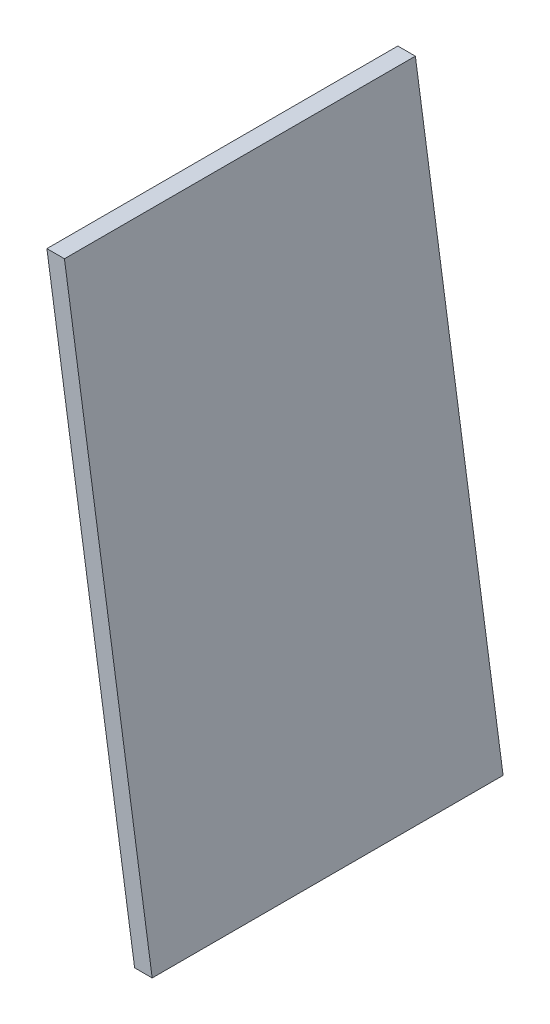
ISO-10303-21;
HEADER;
FILE_DESCRIPTION(('STEP AP214'),'2;1');
FILE_NAME('part.step','',(''),(''),'','','');
FILE_SCHEMA(('AUTOMOTIVE_DESIGN { 1 0 10303 214 1 1 1 1 }'));
ENDSEC;
DATA;
#1=APPLICATION_CONTEXT('core data for automotive mechanical design processes');
#2=APPLICATION_PROTOCOL_DEFINITION('international standard','automotive_design',2000,#1);
#3=PRODUCT_CONTEXT('',#1,'mechanical');
#4=PRODUCT('Part','Part','',(#3));
#5=PRODUCT_RELATED_PRODUCT_CATEGORY('part','',(#4));
#6=PRODUCT_DEFINITION_FORMATION('','',#4);
#7=PRODUCT_DEFINITION_CONTEXT('part definition',#1,'design');
#8=PRODUCT_DEFINITION('design','',#6,#7);
#9=PRODUCT_DEFINITION_SHAPE('','',#8);
#10=(LENGTH_UNIT() NAMED_UNIT(*) SI_UNIT(.MILLI.,.METRE.));
#11=(NAMED_UNIT(*) PLANE_ANGLE_UNIT() SI_UNIT($,.RADIAN.));
#12=(NAMED_UNIT(*) SI_UNIT($,.STERADIAN.) SOLID_ANGLE_UNIT());
#13=UNCERTAINTY_MEASURE_WITH_UNIT(LENGTH_MEASURE(1.E-05),#10,'distance_accuracy_value','');
#14=(GEOMETRIC_REPRESENTATION_CONTEXT(3) GLOBAL_UNCERTAINTY_ASSIGNED_CONTEXT((#13)) GLOBAL_UNIT_ASSIGNED_CONTEXT((#10,
#11,#12)) REPRESENTATION_CONTEXT('',''));
#15=CARTESIAN_POINT('',(0.,0.,0.));
#16=DIRECTION('',(0.,0.,1.));
#17=DIRECTION('',(1.,0.,0.));
#18=AXIS2_PLACEMENT_3D('',#15,#16,#17);
#19=CARTESIAN_POINT('',(0.,0.,100.));
#20=DIRECTION('',(-0.988715504224767,-0.149805379427995,0.));
#21=DIRECTION('',(0.149805379427995,-0.988715504224767,0.));
#22=AXIS2_PLACEMENT_3D('',#19,#20,#21);
#23=PLANE('',#22);
#24=DIRECTION('',(-0.149805379427995,0.988715504224767,0.));
#25=VECTOR('',#24,1.);
#26=CARTESIAN_POINT('',(0.,0.,-100.));
#27=LINE('',#26,#25);
#28=CARTESIAN_POINT('',(0.,0.,-100.));
#29=VERTEX_POINT('',#28);
#30=CARTESIAN_POINT('',(-50.,330.,-100.));
#31=VERTEX_POINT('',#30);
#32=EDGE_CURVE('E113',#29,#31,#27,.T.);
#33=ORIENTED_EDGE('',*,*,#32,.T.);
#34=DIRECTION('',(0.,0.,-1.));
#35=VECTOR('',#34,1.);
#36=CARTESIAN_POINT('',(-50.,330.,100.));
#37=LINE('',#36,#35);
#38=CARTESIAN_POINT('',(-50.,330.,100.));
#39=VERTEX_POINT('',#38);
#40=EDGE_CURVE('E11',#39,#31,#37,.T.);
#41=ORIENTED_EDGE('',*,*,#40,.F.);
#42=DIRECTION('',(-0.149805379427995,0.988715504224767,0.));
#43=VECTOR('',#42,1.);
#44=CARTESIAN_POINT('',(0.,0.,100.));
#45=LINE('',#44,#43);
#46=CARTESIAN_POINT('',(0.,0.,100.));
#47=VERTEX_POINT('',#46);
#48=EDGE_CURVE('E97',#47,#39,#45,.T.);
#49=ORIENTED_EDGE('',*,*,#48,.F.);
#50=DIRECTION('',(0.,0.,-1.));
#51=VECTOR('',#50,1.);
#52=CARTESIAN_POINT('',(0.,0.,100.));
#53=LINE('',#52,#51);
#54=EDGE_CURVE('E109',#47,#29,#53,.T.);
#55=ORIENTED_EDGE('',*,*,#54,.T.);
#56=EDGE_LOOP('',(#33,#41,#49,#55));
#57=FACE_BOUND('',#56,.T.);
#58=ADVANCED_FACE('F45',(#57),#23,.F.);
#59=CARTESIAN_POINT('',(-50.,330.,100.));
#60=DIRECTION('',(0.,-1.,0.));
#61=DIRECTION('',(0.,0.,-1.));
#62=AXIS2_PLACEMENT_3D('',#59,#60,#61);
#63=PLANE('',#62);
#64=DIRECTION('',(-1.,0.,0.));
#65=VECTOR('',#64,1.);
#66=CARTESIAN_POINT('',(-50.,330.,-100.));
#67=LINE('',#66,#65);
#68=CARTESIAN_POINT('',(-60.,330.,-100.));
#69=VERTEX_POINT('',#68);
#70=EDGE_CURVE('E102',#31,#69,#67,.T.);
#71=ORIENTED_EDGE('',*,*,#70,.T.);
#72=DIRECTION('',(0.,0.,-1.));
#73=VECTOR('',#72,1.);
#74=CARTESIAN_POINT('',(-60.,330.,100.));
#75=LINE('',#74,#73);
#76=CARTESIAN_POINT('',(-60.,330.,100.));
#77=VERTEX_POINT('',#76);
#78=EDGE_CURVE('E54',#77,#69,#75,.T.);
#79=ORIENTED_EDGE('',*,*,#78,.F.);
#80=DIRECTION('',(-1.,0.,0.));
#81=VECTOR('',#80,1.);
#82=CARTESIAN_POINT('',(-50.,330.,100.));
#83=LINE('',#82,#81);
#84=EDGE_CURVE('E92',#39,#77,#83,.T.);
#85=ORIENTED_EDGE('',*,*,#84,.F.);
#86=ORIENTED_EDGE('',*,*,#40,.T.);
#87=EDGE_LOOP('',(#71,#79,#85,#86));
#88=FACE_BOUND('',#87,.T.);
#89=ADVANCED_FACE('F101',(#88),#63,.F.);
#90=CARTESIAN_POINT('',(-9.99999999999999,0.,100.));
#91=DIRECTION('',(0.988715504224767,0.149805379427995,0.));
#92=DIRECTION('',(-0.149805379427995,0.988715504224767,0.));
#93=AXIS2_PLACEMENT_3D('',#90,#91,#92);
#94=PLANE('',#93);
#95=DIRECTION('',(0.149805379427995,-0.988715504224767,0.));
#96=VECTOR('',#95,1.);
#97=CARTESIAN_POINT('',(-9.99999999999999,0.,-100.));
#98=LINE('',#97,#96);
#99=CARTESIAN_POINT('',(-9.99999999999999,0.,-100.));
#100=VERTEX_POINT('',#99);
#101=EDGE_CURVE('E79',#69,#100,#98,.T.);
#102=ORIENTED_EDGE('',*,*,#101,.T.);
#103=DIRECTION('',(0.,0.,-1.));
#104=VECTOR('',#103,1.);
#105=CARTESIAN_POINT('',(-9.99999999999999,0.,100.));
#106=LINE('',#105,#104);
#107=CARTESIAN_POINT('',(-9.99999999999999,0.,100.));
#108=VERTEX_POINT('',#107);
#109=EDGE_CURVE('E104',#108,#100,#106,.T.);
#110=ORIENTED_EDGE('',*,*,#109,.F.);
#111=DIRECTION('',(0.149805379427995,-0.988715504224767,0.));
#112=VECTOR('',#111,1.);
#113=CARTESIAN_POINT('',(-9.99999999999999,0.,100.));
#114=LINE('',#113,#112);
#115=EDGE_CURVE('E95',#77,#108,#114,.T.);
#116=ORIENTED_EDGE('',*,*,#115,.F.);
#117=ORIENTED_EDGE('',*,*,#78,.T.);
#118=EDGE_LOOP('',(#102,#110,#116,#117));
#119=FACE_BOUND('',#118,.T.);
#120=ADVANCED_FACE('F105',(#119),#94,.F.);
#121=CARTESIAN_POINT('',(0.,0.,100.));
#122=DIRECTION('',(0.,1.,0.));
#123=DIRECTION('',(-1.,0.,0.));
#124=AXIS2_PLACEMENT_3D('',#121,#122,#123);
#125=PLANE('',#124);
#126=DIRECTION('',(1.,0.,0.));
#127=VECTOR('',#126,1.);
#128=CARTESIAN_POINT('',(0.,0.,-100.));
#129=LINE('',#128,#127);
#130=EDGE_CURVE('E85',#100,#29,#129,.T.);
#131=ORIENTED_EDGE('',*,*,#130,.T.);
#132=ORIENTED_EDGE('',*,*,#54,.F.);
#133=DIRECTION('',(1.,0.,0.));
#134=VECTOR('',#133,1.);
#135=CARTESIAN_POINT('',(0.,0.,100.));
#136=LINE('',#135,#134);
#137=EDGE_CURVE('E62',#108,#47,#136,.T.);
#138=ORIENTED_EDGE('',*,*,#137,.F.);
#139=ORIENTED_EDGE('',*,*,#109,.T.);
#140=EDGE_LOOP('',(#131,#132,#138,#139));
#141=FACE_BOUND('',#140,.T.);
#142=ADVANCED_FACE('F126',(#141),#125,.F.);
#143=CARTESIAN_POINT('',(0.,0.,100.));
#144=DIRECTION('',(0.,0.,1.));
#145=DIRECTION('',(1.,0.,0.));
#146=AXIS2_PLACEMENT_3D('',#143,#144,#145);
#147=PLANE('',#146);
#148=ORIENTED_EDGE('',*,*,#48,.T.);
#149=ORIENTED_EDGE('',*,*,#84,.T.);
#150=ORIENTED_EDGE('',*,*,#115,.T.);
#151=ORIENTED_EDGE('',*,*,#137,.T.);
#152=EDGE_LOOP('',(#148,#149,#150,#151));
#153=FACE_BOUND('',#152,.T.);
#154=ADVANCED_FACE('F93',(#153),#147,.T.);
#155=CARTESIAN_POINT('',(0.,0.,-100.));
#156=DIRECTION('',(0.,0.,1.));
#157=DIRECTION('',(1.,0.,0.));
#158=AXIS2_PLACEMENT_3D('',#155,#156,#157);
#159=PLANE('',#158);
#160=ORIENTED_EDGE('',*,*,#32,.F.);
#161=ORIENTED_EDGE('',*,*,#130,.F.);
#162=ORIENTED_EDGE('',*,*,#101,.F.);
#163=ORIENTED_EDGE('',*,*,#70,.F.);
#164=EDGE_LOOP('',(#160,#161,#162,#163));
#165=FACE_BOUND('',#164,.T.);
#166=ADVANCED_FACE('F129',(#165),#159,.F.);
#167=CLOSED_SHELL('',(#58,#89,#120,#142,#154,#166));
#168=MANIFOLD_SOLID_BREP('B2',#167);
#169=ADVANCED_BREP_SHAPE_REPRESENTATION('',(#18,#168),#14);
#170=SHAPE_DEFINITION_REPRESENTATION(#9,#169);
ENDSEC;
END-ISO-10303-21;
